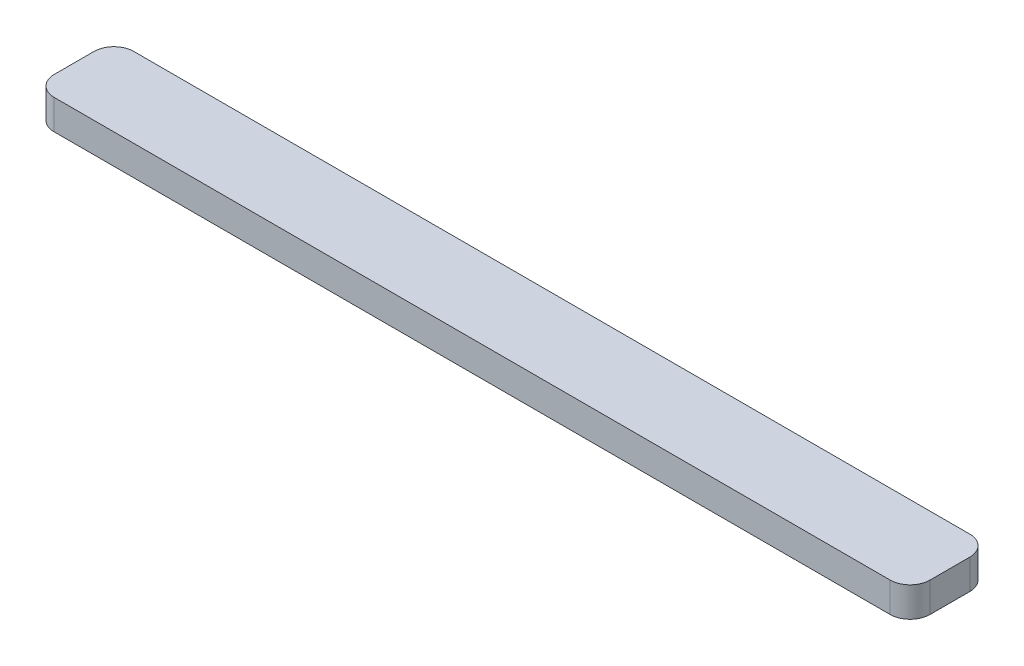
ISO-10303-21;
HEADER;
FILE_DESCRIPTION(('STEP AP214'),'2;1');
FILE_NAME('part.step','',(''),(''),'','','');
FILE_SCHEMA(('AUTOMOTIVE_DESIGN { 1 0 10303 214 1 1 1 1 }'));
ENDSEC;
DATA;
#1=APPLICATION_CONTEXT('core data for automotive mechanical design processes');
#2=APPLICATION_PROTOCOL_DEFINITION('international standard','automotive_design',2000,#1);
#3=PRODUCT_CONTEXT('',#1,'mechanical');
#4=PRODUCT('Part','Part','',(#3));
#5=PRODUCT_RELATED_PRODUCT_CATEGORY('part','',(#4));
#6=PRODUCT_DEFINITION_FORMATION('','',#4);
#7=PRODUCT_DEFINITION_CONTEXT('part definition',#1,'design');
#8=PRODUCT_DEFINITION('design','',#6,#7);
#9=PRODUCT_DEFINITION_SHAPE('','',#8);
#10=(LENGTH_UNIT() NAMED_UNIT(*) SI_UNIT(.MILLI.,.METRE.));
#11=(NAMED_UNIT(*) PLANE_ANGLE_UNIT() SI_UNIT($,.RADIAN.));
#12=(NAMED_UNIT(*) SI_UNIT($,.STERADIAN.) SOLID_ANGLE_UNIT());
#13=UNCERTAINTY_MEASURE_WITH_UNIT(LENGTH_MEASURE(1.E-05),#10,'distance_accuracy_value','');
#14=(GEOMETRIC_REPRESENTATION_CONTEXT(3) GLOBAL_UNCERTAINTY_ASSIGNED_CONTEXT((#13)) GLOBAL_UNIT_ASSIGNED_CONTEXT((#10,
#11,#12)) REPRESENTATION_CONTEXT('',''));
#15=CARTESIAN_POINT('',(0.,0.,0.));
#16=DIRECTION('',(0.,0.,1.));
#17=DIRECTION('',(1.,0.,0.));
#18=AXIS2_PLACEMENT_3D('',#15,#16,#17);
#19=CARTESIAN_POINT('',(-42.,3.,2.));
#20=DIRECTION('',(0.,-1.,0.));
#21=DIRECTION('',(0.,0.,-1.));
#22=AXIS2_PLACEMENT_3D('',#19,#20,#21);
#23=CYLINDRICAL_SURFACE('',#22,2.);
#24=CARTESIAN_POINT('',(-42.,0.,2.));
#25=DIRECTION('',(0.,1.,0.));
#26=DIRECTION('',(0.,0.,1.));
#27=AXIS2_PLACEMENT_3D('',#24,#25,#26);
#28=CIRCLE('',#27,2.);
#29=CARTESIAN_POINT('',(-44.,0.,1.99999999999999));
#30=VERTEX_POINT('',#29);
#31=CARTESIAN_POINT('',(-42.,0.,4.));
#32=VERTEX_POINT('',#31);
#33=EDGE_CURVE('E134',#30,#32,#28,.T.);
#34=ORIENTED_EDGE('',*,*,#33,.T.);
#35=DIRECTION('',(0.,-1.,0.));
#36=VECTOR('',#35,1.);
#37=CARTESIAN_POINT('',(-42.,3.,4.));
#38=LINE('',#37,#36);
#39=CARTESIAN_POINT('',(-42.,3.,4.));
#40=VERTEX_POINT('',#39);
#41=EDGE_CURVE('E11',#40,#32,#38,.T.);
#42=ORIENTED_EDGE('',*,*,#41,.F.);
#43=CARTESIAN_POINT('',(-42.,3.,2.));
#44=DIRECTION('',(0.,1.,0.));
#45=DIRECTION('',(0.,0.,1.));
#46=AXIS2_PLACEMENT_3D('',#43,#44,#45);
#47=CIRCLE('',#46,2.);
#48=CARTESIAN_POINT('',(-44.,3.,1.99999999999999));
#49=VERTEX_POINT('',#48);
#50=EDGE_CURVE('E148',#49,#40,#47,.T.);
#51=ORIENTED_EDGE('',*,*,#50,.F.);
#52=DIRECTION('',(0.,-1.,0.));
#53=VECTOR('',#52,1.);
#54=CARTESIAN_POINT('',(-44.,3.,1.99999999999999));
#55=LINE('',#54,#53);
#56=EDGE_CURVE('E130',#49,#30,#55,.T.);
#57=ORIENTED_EDGE('',*,*,#56,.T.);
#58=EDGE_LOOP('',(#34,#42,#51,#57));
#59=FACE_BOUND('',#58,.T.);
#60=ADVANCED_FACE('F38',(#59),#23,.T.);
#61=CARTESIAN_POINT('',(42.,3.,3.99999999999999));
#62=DIRECTION('',(0.,0.,-1.));
#63=DIRECTION('',(-1.,0.,0.));
#64=AXIS2_PLACEMENT_3D('',#61,#62,#63);
#65=PLANE('',#64);
#66=DIRECTION('',(1.,0.,0.));
#67=VECTOR('',#66,1.);
#68=CARTESIAN_POINT('',(42.,0.,3.99999999999999));
#69=LINE('',#68,#67);
#70=CARTESIAN_POINT('',(42.,0.,3.99999999999999));
#71=VERTEX_POINT('',#70);
#72=EDGE_CURVE('E137',#32,#71,#69,.T.);
#73=ORIENTED_EDGE('',*,*,#72,.T.);
#74=DIRECTION('',(0.,-1.,0.));
#75=VECTOR('',#74,1.);
#76=CARTESIAN_POINT('',(42.,3.,3.99999999999999));
#77=LINE('',#76,#75);
#78=CARTESIAN_POINT('',(42.,3.,3.99999999999999));
#79=VERTEX_POINT('',#78);
#80=EDGE_CURVE('E46',#79,#71,#77,.T.);
#81=ORIENTED_EDGE('',*,*,#80,.F.);
#82=DIRECTION('',(1.,0.,0.));
#83=VECTOR('',#82,1.);
#84=CARTESIAN_POINT('',(42.,3.,3.99999999999999));
#85=LINE('',#84,#83);
#86=EDGE_CURVE('E97',#40,#79,#85,.T.);
#87=ORIENTED_EDGE('',*,*,#86,.F.);
#88=ORIENTED_EDGE('',*,*,#41,.T.);
#89=EDGE_LOOP('',(#73,#81,#87,#88));
#90=FACE_BOUND('',#89,.T.);
#91=ADVANCED_FACE('F183',(#90),#65,.F.);
#92=CARTESIAN_POINT('',(42.,3.,1.99999999999999));
#93=DIRECTION('',(0.,-1.,0.));
#94=DIRECTION('',(0.,0.,-1.));
#95=AXIS2_PLACEMENT_3D('',#92,#93,#94);
#96=CYLINDRICAL_SURFACE('',#95,2.);
#97=CARTESIAN_POINT('',(42.,0.,1.99999999999999));
#98=DIRECTION('',(0.,1.,0.));
#99=DIRECTION('',(0.,0.,-1.));
#100=AXIS2_PLACEMENT_3D('',#97,#98,#99);
#101=CIRCLE('',#100,2.);
#102=CARTESIAN_POINT('',(44.,0.,1.99999999999998));
#103=VERTEX_POINT('',#102);
#104=EDGE_CURVE('E139',#71,#103,#101,.T.);
#105=ORIENTED_EDGE('',*,*,#104,.T.);
#106=DIRECTION('',(0.,-1.,0.));
#107=VECTOR('',#106,1.);
#108=CARTESIAN_POINT('',(44.,3.,1.99999999999998));
#109=LINE('',#108,#107);
#110=CARTESIAN_POINT('',(44.,3.,1.99999999999998));
#111=VERTEX_POINT('',#110);
#112=EDGE_CURVE('E155',#111,#103,#109,.T.);
#113=ORIENTED_EDGE('',*,*,#112,.F.);
#114=CARTESIAN_POINT('',(42.,3.,1.99999999999999));
#115=DIRECTION('',(0.,1.,0.));
#116=DIRECTION('',(0.,0.,-1.));
#117=AXIS2_PLACEMENT_3D('',#114,#115,#116);
#118=CIRCLE('',#117,2.);
#119=EDGE_CURVE('E163',#79,#111,#118,.T.);
#120=ORIENTED_EDGE('',*,*,#119,.F.);
#121=ORIENTED_EDGE('',*,*,#80,.T.);
#122=EDGE_LOOP('',(#105,#113,#120,#121));
#123=FACE_BOUND('',#122,.T.);
#124=ADVANCED_FACE('F161',(#123),#96,.T.);
#125=CARTESIAN_POINT('',(44.,3.,1.99999999999998));
#126=DIRECTION('',(-1.,0.,0.));
#127=DIRECTION('',(0.,0.,1.));
#128=AXIS2_PLACEMENT_3D('',#125,#126,#127);
#129=PLANE('',#128);
#130=DIRECTION('',(0.,0.,-1.));
#131=VECTOR('',#130,1.);
#132=CARTESIAN_POINT('',(44.,0.,1.99999999999998));
#133=LINE('',#132,#131);
#134=CARTESIAN_POINT('',(44.,0.,-1.99999999999999));
#135=VERTEX_POINT('',#134);
#136=EDGE_CURVE('E141',#103,#135,#133,.T.);
#137=ORIENTED_EDGE('',*,*,#136,.T.);
#138=DIRECTION('',(0.,-1.,0.));
#139=VECTOR('',#138,1.);
#140=CARTESIAN_POINT('',(44.,3.,-1.99999999999999));
#141=LINE('',#140,#139);
#142=CARTESIAN_POINT('',(44.,3.,-1.99999999999999));
#143=VERTEX_POINT('',#142);
#144=EDGE_CURVE('E152',#143,#135,#141,.T.);
#145=ORIENTED_EDGE('',*,*,#144,.F.);
#146=DIRECTION('',(0.,0.,-1.));
#147=VECTOR('',#146,1.);
#148=CARTESIAN_POINT('',(44.,3.,1.99999999999998));
#149=LINE('',#148,#147);
#150=EDGE_CURVE('E175',#111,#143,#149,.T.);
#151=ORIENTED_EDGE('',*,*,#150,.F.);
#152=ORIENTED_EDGE('',*,*,#112,.T.);
#153=EDGE_LOOP('',(#137,#145,#151,#152));
#154=FACE_BOUND('',#153,.T.);
#155=ADVANCED_FACE('F171',(#154),#129,.F.);
#156=CARTESIAN_POINT('',(42.,3.,-2.00000000000001));
#157=DIRECTION('',(0.,-1.,0.));
#158=DIRECTION('',(0.,0.,-1.));
#159=AXIS2_PLACEMENT_3D('',#156,#157,#158);
#160=CYLINDRICAL_SURFACE('',#159,2.);
#161=CARTESIAN_POINT('',(42.,0.,-2.00000000000001));
#162=DIRECTION('',(0.,1.,0.));
#163=DIRECTION('',(0.,0.,1.));
#164=AXIS2_PLACEMENT_3D('',#161,#162,#163);
#165=CIRCLE('',#164,2.);
#166=CARTESIAN_POINT('',(42.,0.,-4.00000000000001));
#167=VERTEX_POINT('',#166);
#168=EDGE_CURVE('E143',#135,#167,#165,.T.);
#169=ORIENTED_EDGE('',*,*,#168,.T.);
#170=DIRECTION('',(0.,-1.,0.));
#171=VECTOR('',#170,1.);
#172=CARTESIAN_POINT('',(42.,3.,-4.00000000000001));
#173=LINE('',#172,#171);
#174=CARTESIAN_POINT('',(42.,3.,-4.00000000000001));
#175=VERTEX_POINT('',#174);
#176=EDGE_CURVE('E125',#175,#167,#173,.T.);
#177=ORIENTED_EDGE('',*,*,#176,.F.);
#178=CARTESIAN_POINT('',(42.,3.,-2.00000000000001));
#179=DIRECTION('',(0.,1.,0.));
#180=DIRECTION('',(0.,0.,1.));
#181=AXIS2_PLACEMENT_3D('',#178,#179,#180);
#182=CIRCLE('',#181,2.);
#183=EDGE_CURVE('E116',#143,#175,#182,.T.);
#184=ORIENTED_EDGE('',*,*,#183,.F.);
#185=ORIENTED_EDGE('',*,*,#144,.T.);
#186=EDGE_LOOP('',(#169,#177,#184,#185));
#187=FACE_BOUND('',#186,.T.);
#188=ADVANCED_FACE('F174',(#187),#160,.T.);
#189=CARTESIAN_POINT('',(42.,3.,-4.00000000000001));
#190=DIRECTION('',(0.,0.,1.));
#191=DIRECTION('',(1.,0.,0.));
#192=AXIS2_PLACEMENT_3D('',#189,#190,#191);
#193=PLANE('',#192);
#194=DIRECTION('',(-1.,0.,0.));
#195=VECTOR('',#194,1.);
#196=CARTESIAN_POINT('',(42.,0.,-4.00000000000001));
#197=LINE('',#196,#195);
#198=CARTESIAN_POINT('',(-42.,0.,-4.));
#199=VERTEX_POINT('',#198);
#200=EDGE_CURVE('E124',#167,#199,#197,.T.);
#201=ORIENTED_EDGE('',*,*,#200,.T.);
#202=DIRECTION('',(0.,-1.,0.));
#203=VECTOR('',#202,1.);
#204=CARTESIAN_POINT('',(-42.,3.,-4.));
#205=LINE('',#204,#203);
#206=CARTESIAN_POINT('',(-42.,3.,-4.));
#207=VERTEX_POINT('',#206);
#208=EDGE_CURVE('E121',#207,#199,#205,.T.);
#209=ORIENTED_EDGE('',*,*,#208,.F.);
#210=DIRECTION('',(-1.,0.,0.));
#211=VECTOR('',#210,1.);
#212=CARTESIAN_POINT('',(42.,3.,-4.00000000000001));
#213=LINE('',#212,#211);
#214=EDGE_CURVE('E110',#175,#207,#213,.T.);
#215=ORIENTED_EDGE('',*,*,#214,.F.);
#216=ORIENTED_EDGE('',*,*,#176,.T.);
#217=EDGE_LOOP('',(#201,#209,#215,#216));
#218=FACE_BOUND('',#217,.T.);
#219=ADVANCED_FACE('F122',(#218),#193,.F.);
#220=CARTESIAN_POINT('',(-42.,3.,-2.));
#221=DIRECTION('',(0.,-1.,0.));
#222=DIRECTION('',(0.,0.,-1.));
#223=AXIS2_PLACEMENT_3D('',#220,#221,#222);
#224=CYLINDRICAL_SURFACE('',#223,2.);
#225=CARTESIAN_POINT('',(-42.,0.,-2.));
#226=DIRECTION('',(0.,1.,0.));
#227=DIRECTION('',(0.,0.,1.));
#228=AXIS2_PLACEMENT_3D('',#225,#226,#227);
#229=CIRCLE('',#228,2.);
#230=CARTESIAN_POINT('',(-44.,0.,-1.99999999999998));
#231=VERTEX_POINT('',#230);
#232=EDGE_CURVE('E83',#199,#231,#229,.T.);
#233=ORIENTED_EDGE('',*,*,#232,.T.);
#234=DIRECTION('',(0.,-1.,0.));
#235=VECTOR('',#234,1.);
#236=CARTESIAN_POINT('',(-44.,3.,-1.99999999999998));
#237=LINE('',#236,#235);
#238=CARTESIAN_POINT('',(-44.,3.,-1.99999999999998));
#239=VERTEX_POINT('',#238);
#240=EDGE_CURVE('E126',#239,#231,#237,.T.);
#241=ORIENTED_EDGE('',*,*,#240,.F.);
#242=CARTESIAN_POINT('',(-42.,3.,-2.));
#243=DIRECTION('',(0.,1.,0.));
#244=DIRECTION('',(0.,0.,1.));
#245=AXIS2_PLACEMENT_3D('',#242,#243,#244);
#246=CIRCLE('',#245,2.);
#247=EDGE_CURVE('E114',#207,#239,#246,.T.);
#248=ORIENTED_EDGE('',*,*,#247,.F.);
#249=ORIENTED_EDGE('',*,*,#208,.T.);
#250=EDGE_LOOP('',(#233,#241,#248,#249));
#251=FACE_BOUND('',#250,.T.);
#252=ADVANCED_FACE('F128',(#251),#224,.T.);
#253=CARTESIAN_POINT('',(-44.,3.,1.99999999999999));
#254=DIRECTION('',(1.,0.,0.));
#255=DIRECTION('',(0.,0.,-1.));
#256=AXIS2_PLACEMENT_3D('',#253,#254,#255);
#257=PLANE('',#256);
#258=DIRECTION('',(0.,0.,1.));
#259=VECTOR('',#258,1.);
#260=CARTESIAN_POINT('',(-44.,0.,1.99999999999999));
#261=LINE('',#260,#259);
#262=EDGE_CURVE('E89',#231,#30,#261,.T.);
#263=ORIENTED_EDGE('',*,*,#262,.T.);
#264=ORIENTED_EDGE('',*,*,#56,.F.);
#265=DIRECTION('',(0.,0.,1.));
#266=VECTOR('',#265,1.);
#267=CARTESIAN_POINT('',(-44.,3.,1.99999999999999));
#268=LINE('',#267,#266);
#269=EDGE_CURVE('E54',#239,#49,#268,.T.);
#270=ORIENTED_EDGE('',*,*,#269,.F.);
#271=ORIENTED_EDGE('',*,*,#240,.T.);
#272=EDGE_LOOP('',(#263,#264,#270,#271));
#273=FACE_BOUND('',#272,.T.);
#274=ADVANCED_FACE('F199',(#273),#257,.F.);
#275=CARTESIAN_POINT('',(-42.,3.,2.));
#276=DIRECTION('',(0.,1.,0.));
#277=DIRECTION('',(0.,0.,1.));
#278=AXIS2_PLACEMENT_3D('',#275,#276,#277);
#279=PLANE('',#278);
#280=ORIENTED_EDGE('',*,*,#50,.T.);
#281=ORIENTED_EDGE('',*,*,#86,.T.);
#282=ORIENTED_EDGE('',*,*,#119,.T.);
#283=ORIENTED_EDGE('',*,*,#150,.T.);
#284=ORIENTED_EDGE('',*,*,#183,.T.);
#285=ORIENTED_EDGE('',*,*,#214,.T.);
#286=ORIENTED_EDGE('',*,*,#247,.T.);
#287=ORIENTED_EDGE('',*,*,#269,.T.);
#288=EDGE_LOOP('',(#280,#281,#282,#283,#284,#285,#286,#287));
#289=FACE_BOUND('',#288,.T.);
#290=ADVANCED_FACE('F112',(#289),#279,.T.);
#291=CARTESIAN_POINT('',(-42.,0.,2.));
#292=DIRECTION('',(0.,1.,0.));
#293=DIRECTION('',(0.,0.,1.));
#294=AXIS2_PLACEMENT_3D('',#291,#292,#293);
#295=PLANE('',#294);
#296=ORIENTED_EDGE('',*,*,#33,.F.);
#297=ORIENTED_EDGE('',*,*,#262,.F.);
#298=ORIENTED_EDGE('',*,*,#232,.F.);
#299=ORIENTED_EDGE('',*,*,#200,.F.);
#300=ORIENTED_EDGE('',*,*,#168,.F.);
#301=ORIENTED_EDGE('',*,*,#136,.F.);
#302=ORIENTED_EDGE('',*,*,#104,.F.);
#303=ORIENTED_EDGE('',*,*,#72,.F.);
#304=EDGE_LOOP('',(#296,#297,#298,#299,#300,#301,#302,#303));
#305=FACE_BOUND('',#304,.T.);
#306=ADVANCED_FACE('F167',(#305),#295,.F.);
#307=CLOSED_SHELL('',(#60,#91,#124,#155,#188,#219,#252,#274,#290,#306));
#308=MANIFOLD_SOLID_BREP('B2',#307);
#309=ADVANCED_BREP_SHAPE_REPRESENTATION('',(#18,#308),#14);
#310=SHAPE_DEFINITION_REPRESENTATION(#9,#309);
ENDSEC;
END-ISO-10303-21;
